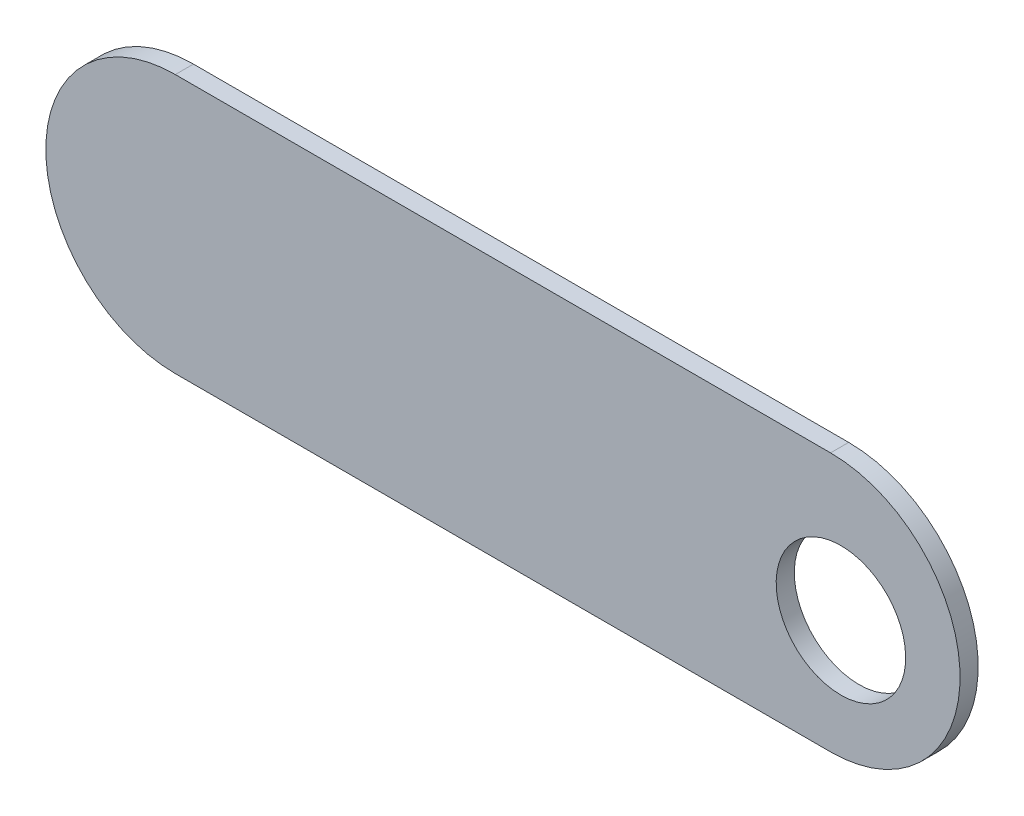
ISO-10303-21;
HEADER;
FILE_DESCRIPTION(('STEP AP214'),'2;1');
FILE_NAME('part.step','',(''),(''),'','','');
FILE_SCHEMA(('AUTOMOTIVE_DESIGN { 1 0 10303 214 1 1 1 1 }'));
ENDSEC;
DATA;
#1=APPLICATION_CONTEXT('core data for automotive mechanical design processes');
#2=APPLICATION_PROTOCOL_DEFINITION('international standard','automotive_design',2000,#1);
#3=PRODUCT_CONTEXT('',#1,'mechanical');
#4=PRODUCT('Part','Part','',(#3));
#5=PRODUCT_RELATED_PRODUCT_CATEGORY('part','',(#4));
#6=PRODUCT_DEFINITION_FORMATION('','',#4);
#7=PRODUCT_DEFINITION_CONTEXT('part definition',#1,'design');
#8=PRODUCT_DEFINITION('design','',#6,#7);
#9=PRODUCT_DEFINITION_SHAPE('','',#8);
#10=(LENGTH_UNIT() NAMED_UNIT(*) SI_UNIT(.MILLI.,.METRE.));
#11=(NAMED_UNIT(*) PLANE_ANGLE_UNIT() SI_UNIT($,.RADIAN.));
#12=(NAMED_UNIT(*) SI_UNIT($,.STERADIAN.) SOLID_ANGLE_UNIT());
#13=UNCERTAINTY_MEASURE_WITH_UNIT(LENGTH_MEASURE(1.E-05),#10,'distance_accuracy_value','');
#14=(GEOMETRIC_REPRESENTATION_CONTEXT(3) GLOBAL_UNCERTAINTY_ASSIGNED_CONTEXT((#13)) GLOBAL_UNIT_ASSIGNED_CONTEXT((#10,
#11,#12)) REPRESENTATION_CONTEXT('',''));
#15=CARTESIAN_POINT('',(0.,0.,0.));
#16=DIRECTION('',(0.,0.,1.));
#17=DIRECTION('',(1.,0.,0.));
#18=AXIS2_PLACEMENT_3D('',#15,#16,#17);
#19=CARTESIAN_POINT('',(112.51,-58.82,-0.045));
#20=DIRECTION('',(0.,0.,-1.));
#21=DIRECTION('',(0.,-1.,0.));
#22=AXIS2_PLACEMENT_3D('',#19,#20,#21);
#23=CYLINDRICAL_SURFACE('',#22,0.125);
#24=CARTESIAN_POINT('',(112.51,-58.82,1.6));
#25=DIRECTION('',(0.,0.,-1.));
#26=DIRECTION('',(0.,-1.,0.));
#27=AXIS2_PLACEMENT_3D('',#24,#25,#26);
#28=CIRCLE('',#27,0.125);
#29=CARTESIAN_POINT('',(112.51,-58.945,1.6));
#30=VERTEX_POINT('',#29);
#31=EDGE_CURVE('E80',#30,#30,#28,.T.);
#32=ORIENTED_EDGE('',*,*,#31,.T.);
#33=DIRECTION('',(0.,0.,1.));
#34=VECTOR('',#33,1.);
#35=CARTESIAN_POINT('',(112.51,-58.945,-0.045));
#36=LINE('',#35,#34);
#37=CARTESIAN_POINT('',(112.51,-58.945,1.635));
#38=VERTEX_POINT('',#37);
#39=EDGE_CURVE('E11',#30,#38,#36,.T.);
#40=ORIENTED_EDGE('',*,*,#39,.T.);
#41=CARTESIAN_POINT('',(112.51,-58.82,1.635));
#42=DIRECTION('',(0.,0.,-1.));
#43=DIRECTION('',(0.,-1.,0.));
#44=AXIS2_PLACEMENT_3D('',#41,#42,#43);
#45=CIRCLE('',#44,0.125);
#46=EDGE_CURVE('E27',#38,#38,#45,.T.);
#47=ORIENTED_EDGE('',*,*,#46,.F.);
#48=ORIENTED_EDGE('',*,*,#39,.F.);
#49=EDGE_LOOP('',(#32,#40,#47,#48));
#50=FACE_BOUND('',#49,.T.);
#51=ADVANCED_FACE('F17',(#50),#23,.F.);
#52=CARTESIAN_POINT('',(112.49,-58.55,1.6));
#53=DIRECTION('',(0.,-1.,0.));
#54=DIRECTION('',(0.,0.,-1.));
#55=AXIS2_PLACEMENT_3D('',#52,#53,#54);
#56=PLANE('',#55);
#57=DIRECTION('',(-1.,0.,0.));
#58=VECTOR('',#57,1.);
#59=CARTESIAN_POINT('',(112.49,-58.55,1.6));
#60=LINE('',#59,#58);
#61=CARTESIAN_POINT('',(112.49,-58.55,1.6));
#62=VERTEX_POINT('',#61);
#63=CARTESIAN_POINT('',(111.225002,-58.55,1.6));
#64=VERTEX_POINT('',#63);
#65=EDGE_CURVE('E89',#62,#64,#60,.T.);
#66=ORIENTED_EDGE('',*,*,#65,.T.);
#67=DIRECTION('',(0.,0.,1.));
#68=VECTOR('',#67,1.);
#69=CARTESIAN_POINT('',(111.225002,-58.55,1.6));
#70=LINE('',#69,#68);
#71=CARTESIAN_POINT('',(111.225002,-58.55,1.635));
#72=VERTEX_POINT('',#71);
#73=EDGE_CURVE('E76',#64,#72,#70,.T.);
#74=ORIENTED_EDGE('',*,*,#73,.T.);
#75=DIRECTION('',(-1.,0.,0.));
#76=VECTOR('',#75,1.);
#77=CARTESIAN_POINT('',(112.49,-58.55,1.635));
#78=LINE('',#77,#76);
#79=CARTESIAN_POINT('',(112.49,-58.55,1.635));
#80=VERTEX_POINT('',#79);
#81=EDGE_CURVE('E69',#80,#72,#78,.T.);
#82=ORIENTED_EDGE('',*,*,#81,.F.);
#83=DIRECTION('',(0.,0.,1.));
#84=VECTOR('',#83,1.);
#85=CARTESIAN_POINT('',(112.49,-58.55,1.6));
#86=LINE('',#85,#84);
#87=EDGE_CURVE('E73',#62,#80,#86,.T.);
#88=ORIENTED_EDGE('',*,*,#87,.F.);
#89=EDGE_LOOP('',(#66,#74,#82,#88));
#90=FACE_BOUND('',#89,.T.);
#91=ADVANCED_FACE('F71',(#90),#56,.F.);
#92=CARTESIAN_POINT('',(111.225002,-59.05,1.635));
#93=DIRECTION('',(0.,0.,1.));
#94=DIRECTION('',(1.,0.,0.));
#95=AXIS2_PLACEMENT_3D('',#92,#93,#94);
#96=PLANE('',#95);
#97=ORIENTED_EDGE('',*,*,#46,.T.);
#98=EDGE_LOOP('',(#97));
#99=FACE_BOUND('',#98,.T.);
#100=DIRECTION('',(1.,0.,0.));
#101=VECTOR('',#100,1.);
#102=CARTESIAN_POINT('',(111.225002,-59.05,1.635));
#103=LINE('',#102,#101);
#104=CARTESIAN_POINT('',(111.225002,-59.05,1.635));
#105=VERTEX_POINT('',#104);
#106=CARTESIAN_POINT('',(112.49,-59.05,1.635));
#107=VERTEX_POINT('',#106);
#108=EDGE_CURVE('E84',#105,#107,#103,.T.);
#109=ORIENTED_EDGE('',*,*,#108,.T.);
#110=CARTESIAN_POINT('',(112.49,-58.8,1.635));
#111=DIRECTION('',(0.,0.,1.));
#112=DIRECTION('',(0.,-1.,0.));
#113=AXIS2_PLACEMENT_3D('',#110,#111,#112);
#114=CIRCLE('',#113,0.25);
#115=EDGE_CURVE('E82',#107,#80,#114,.T.);
#116=ORIENTED_EDGE('',*,*,#115,.T.);
#117=ORIENTED_EDGE('',*,*,#81,.T.);
#118=CARTESIAN_POINT('',(111.225002,-58.8,1.635));
#119=DIRECTION('',(0.,0.,1.));
#120=DIRECTION('',(0.,1.,0.));
#121=AXIS2_PLACEMENT_3D('',#118,#119,#120);
#122=CIRCLE('',#121,0.25);
#123=EDGE_CURVE('E124',#72,#105,#122,.T.);
#124=ORIENTED_EDGE('',*,*,#123,.T.);
#125=EDGE_LOOP('',(#109,#116,#117,#124));
#126=FACE_BOUND('',#125,.T.);
#127=ADVANCED_FACE('F19',(#99,#126),#96,.T.);
#128=CARTESIAN_POINT('',(111.225002,-59.05,1.6));
#129=DIRECTION('',(0.,0.,1.));
#130=DIRECTION('',(1.,0.,0.));
#131=AXIS2_PLACEMENT_3D('',#128,#129,#130);
#132=PLANE('',#131);
#133=ORIENTED_EDGE('',*,*,#31,.F.);
#134=EDGE_LOOP('',(#133));
#135=FACE_BOUND('',#134,.T.);
#136=CARTESIAN_POINT('',(111.225002,-58.8,1.6));
#137=DIRECTION('',(0.,0.,1.));
#138=DIRECTION('',(0.,1.,0.));
#139=AXIS2_PLACEMENT_3D('',#136,#137,#138);
#140=CIRCLE('',#139,0.25);
#141=CARTESIAN_POINT('',(111.225002,-59.05,1.6));
#142=VERTEX_POINT('',#141);
#143=EDGE_CURVE('E116',#64,#142,#140,.T.);
#144=ORIENTED_EDGE('',*,*,#143,.F.);
#145=ORIENTED_EDGE('',*,*,#65,.F.);
#146=CARTESIAN_POINT('',(112.49,-58.8,1.6));
#147=DIRECTION('',(0.,0.,1.));
#148=DIRECTION('',(0.,-1.,0.));
#149=AXIS2_PLACEMENT_3D('',#146,#147,#148);
#150=CIRCLE('',#149,0.25);
#151=CARTESIAN_POINT('',(112.49,-59.05,1.6));
#152=VERTEX_POINT('',#151);
#153=EDGE_CURVE('E93',#152,#62,#150,.T.);
#154=ORIENTED_EDGE('',*,*,#153,.F.);
#155=DIRECTION('',(1.,0.,0.));
#156=VECTOR('',#155,1.);
#157=CARTESIAN_POINT('',(111.225002,-59.05,1.6));
#158=LINE('',#157,#156);
#159=EDGE_CURVE('E119',#142,#152,#158,.T.);
#160=ORIENTED_EDGE('',*,*,#159,.F.);
#161=EDGE_LOOP('',(#144,#145,#154,#160));
#162=FACE_BOUND('',#161,.T.);
#163=ADVANCED_FACE('F110',(#135,#162),#132,.F.);
#164=CARTESIAN_POINT('',(112.49,-58.8,1.6));
#165=DIRECTION('',(0.,0.,-1.));
#166=DIRECTION('',(0.,-1.,0.));
#167=AXIS2_PLACEMENT_3D('',#164,#165,#166);
#168=CYLINDRICAL_SURFACE('',#167,0.25);
#169=ORIENTED_EDGE('',*,*,#153,.T.);
#170=ORIENTED_EDGE('',*,*,#87,.T.);
#171=ORIENTED_EDGE('',*,*,#115,.F.);
#172=DIRECTION('',(0.,0.,1.));
#173=VECTOR('',#172,1.);
#174=CARTESIAN_POINT('',(112.49,-59.05,1.6));
#175=LINE('',#174,#173);
#176=EDGE_CURVE('E136',#152,#107,#175,.T.);
#177=ORIENTED_EDGE('',*,*,#176,.F.);
#178=EDGE_LOOP('',(#169,#170,#171,#177));
#179=FACE_BOUND('',#178,.T.);
#180=ADVANCED_FACE('F91',(#179),#168,.T.);
#181=CARTESIAN_POINT('',(111.225002,-58.8,1.6));
#182=DIRECTION('',(0.,0.,-1.));
#183=DIRECTION('',(0.,1.,0.));
#184=AXIS2_PLACEMENT_3D('',#181,#182,#183);
#185=CYLINDRICAL_SURFACE('',#184,0.25);
#186=ORIENTED_EDGE('',*,*,#143,.T.);
#187=DIRECTION('',(0.,0.,1.));
#188=VECTOR('',#187,1.);
#189=CARTESIAN_POINT('',(111.225002,-59.05,1.6));
#190=LINE('',#189,#188);
#191=EDGE_CURVE('E125',#142,#105,#190,.T.);
#192=ORIENTED_EDGE('',*,*,#191,.T.);
#193=ORIENTED_EDGE('',*,*,#123,.F.);
#194=ORIENTED_EDGE('',*,*,#73,.F.);
#195=EDGE_LOOP('',(#186,#192,#193,#194));
#196=FACE_BOUND('',#195,.T.);
#197=ADVANCED_FACE('F169',(#196),#185,.T.);
#198=CARTESIAN_POINT('',(111.225002,-59.05,1.6));
#199=DIRECTION('',(0.,1.,0.));
#200=DIRECTION('',(1.,0.,0.));
#201=AXIS2_PLACEMENT_3D('',#198,#199,#200);
#202=PLANE('',#201);
#203=ORIENTED_EDGE('',*,*,#159,.T.);
#204=ORIENTED_EDGE('',*,*,#176,.T.);
#205=ORIENTED_EDGE('',*,*,#108,.F.);
#206=ORIENTED_EDGE('',*,*,#191,.F.);
#207=EDGE_LOOP('',(#203,#204,#205,#206));
#208=FACE_BOUND('',#207,.T.);
#209=ADVANCED_FACE('F145',(#208),#202,.F.);
#210=CLOSED_SHELL('',(#51,#91,#127,#163,#180,#197,#209));
#211=MANIFOLD_SOLID_BREP('B1',#210);
#212=ADVANCED_BREP_SHAPE_REPRESENTATION('',(#18,#211),#14);
#213=SHAPE_DEFINITION_REPRESENTATION(#9,#212);
ENDSEC;
END-ISO-10303-21;
